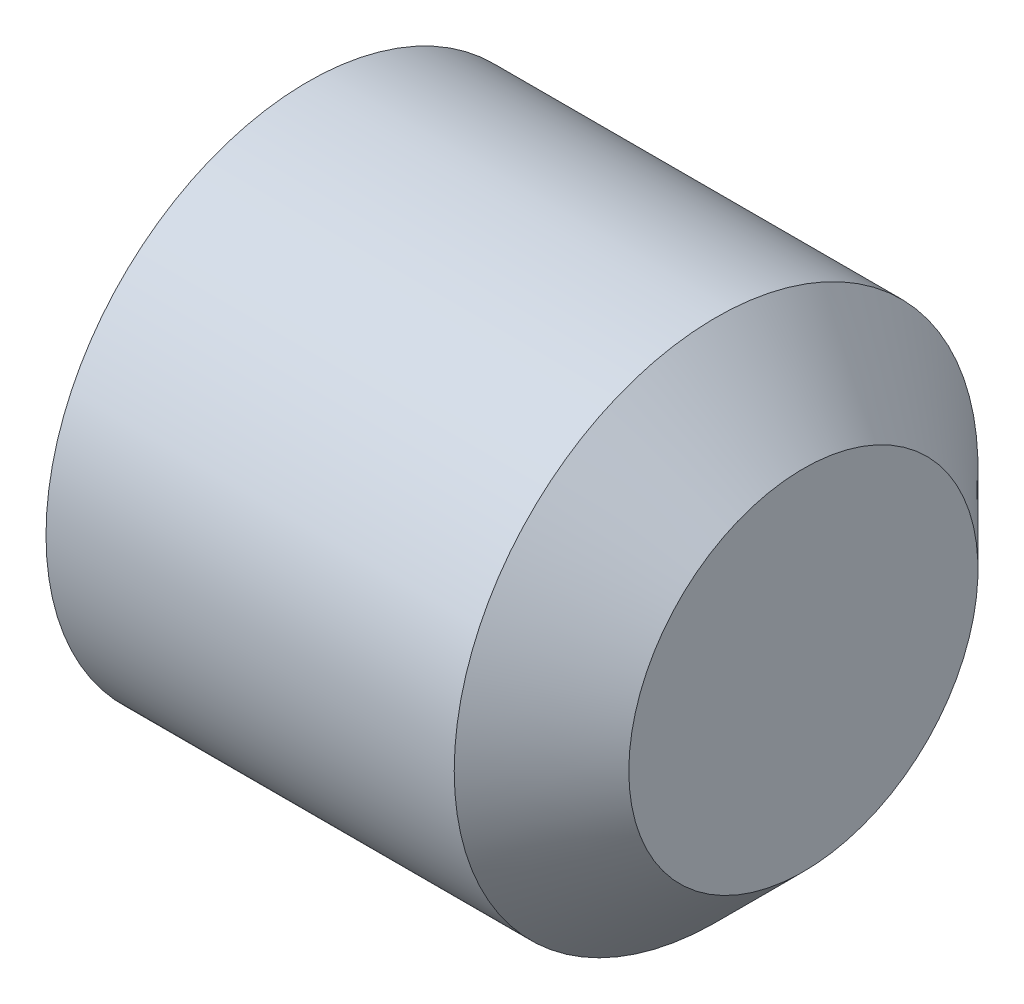
ISO-10303-21;
HEADER;
FILE_DESCRIPTION(('STEP AP214'),'2;1');
FILE_NAME('part.step','',(''),(''),'','','');
FILE_SCHEMA(('AUTOMOTIVE_DESIGN { 1 0 10303 214 1 1 1 1 }'));
ENDSEC;
DATA;
#1=APPLICATION_CONTEXT('core data for automotive mechanical design processes');
#2=APPLICATION_PROTOCOL_DEFINITION('international standard','automotive_design',2000,#1);
#3=PRODUCT_CONTEXT('',#1,'mechanical');
#4=PRODUCT('Part','Part','',(#3));
#5=PRODUCT_RELATED_PRODUCT_CATEGORY('part','',(#4));
#6=PRODUCT_DEFINITION_FORMATION('','',#4);
#7=PRODUCT_DEFINITION_CONTEXT('part definition',#1,'design');
#8=PRODUCT_DEFINITION('design','',#6,#7);
#9=PRODUCT_DEFINITION_SHAPE('','',#8);
#10=(LENGTH_UNIT() NAMED_UNIT(*) SI_UNIT(.MILLI.,.METRE.));
#11=(NAMED_UNIT(*) PLANE_ANGLE_UNIT() SI_UNIT($,.RADIAN.));
#12=(NAMED_UNIT(*) SI_UNIT($,.STERADIAN.) SOLID_ANGLE_UNIT());
#13=UNCERTAINTY_MEASURE_WITH_UNIT(LENGTH_MEASURE(1.E-05),#10,'distance_accuracy_value','');
#14=(GEOMETRIC_REPRESENTATION_CONTEXT(3) GLOBAL_UNCERTAINTY_ASSIGNED_CONTEXT((#13)) GLOBAL_UNIT_ASSIGNED_CONTEXT((#10,
#11,#12)) REPRESENTATION_CONTEXT('',''));
#15=CARTESIAN_POINT('',(0.,0.,0.));
#16=DIRECTION('',(0.,0.,1.));
#17=DIRECTION('',(1.,0.,0.));
#18=AXIS2_PLACEMENT_3D('',#15,#16,#17);
#19=CARTESIAN_POINT('',(0.,0.,0.));
#20=DIRECTION('',(-1.,0.,0.));
#21=DIRECTION('',(0.,0.,1.));
#22=AXIS2_PLACEMENT_3D('',#19,#20,#21);
#23=PLANE('',#22);
#24=CARTESIAN_POINT('',(0.,0.,0.));
#25=DIRECTION('',(-1.,0.,0.));
#26=DIRECTION('',(0.,0.,1.));
#27=AXIS2_PLACEMENT_3D('',#24,#25,#26);
#28=CIRCLE('',#27,1.2195);
#29=CARTESIAN_POINT('',(0.,0.,1.2195));
#30=VERTEX_POINT('',#29);
#31=EDGE_CURVE('E11',#30,#30,#28,.T.);
#32=ORIENTED_EDGE('',*,*,#31,.T.);
#33=EDGE_LOOP('',(#32));
#34=FACE_BOUND('',#33,.T.);
#35=DIRECTION('',(0.,0.,-1.));
#36=VECTOR('',#35,1.);
#37=CARTESIAN_POINT('',(0.,0.750000000000003,0.433012701892217));
#38=LINE('',#37,#36);
#39=CARTESIAN_POINT('',(0.,0.750000000000003,0.433012701892217));
#40=VERTEX_POINT('',#39);
#41=CARTESIAN_POINT('',(0.,0.750000000000003,-0.433012701892222));
#42=VERTEX_POINT('',#41);
#43=EDGE_CURVE('E126',#40,#42,#38,.T.);
#44=ORIENTED_EDGE('',*,*,#43,.F.);
#45=DIRECTION('',(0.,-0.866025403784438,0.5));
#46=VECTOR('',#45,1.);
#47=CARTESIAN_POINT('',(0.,0.750000000000003,0.433012701892217));
#48=LINE('',#47,#46);
#49=CARTESIAN_POINT('',(0.,0.,0.866025403784437));
#50=VERTEX_POINT('',#49);
#51=EDGE_CURVE('E48',#40,#50,#48,.T.);
#52=ORIENTED_EDGE('',*,*,#51,.T.);
#53=DIRECTION('',(0.,0.866025403784439,0.5));
#54=VECTOR('',#53,1.);
#55=CARTESIAN_POINT('',(0.,-0.749999999999996,0.433012701892218));
#56=LINE('',#55,#54);
#57=CARTESIAN_POINT('',(0.,-0.749999999999996,0.433012701892218));
#58=VERTEX_POINT('',#57);
#59=EDGE_CURVE('E117',#58,#50,#56,.T.);
#60=ORIENTED_EDGE('',*,*,#59,.F.);
#61=DIRECTION('',(0.,0.,-1.));
#62=VECTOR('',#61,1.);
#63=CARTESIAN_POINT('',(0.,-0.749999999999996,0.433012701892218));
#64=LINE('',#63,#62);
#65=CARTESIAN_POINT('',(0.,-0.749999999999996,-0.433012701892221));
#66=VERTEX_POINT('',#65);
#67=EDGE_CURVE('E120',#58,#66,#64,.T.);
#68=ORIENTED_EDGE('',*,*,#67,.T.);
#69=DIRECTION('',(0.,0.866025403784438,-0.500000000000001));
#70=VECTOR('',#69,1.);
#71=CARTESIAN_POINT('',(0.,-0.749999999999996,-0.433012701892221));
#72=LINE('',#71,#70);
#73=CARTESIAN_POINT('',(0.,0.,-0.866025403784441));
#74=VERTEX_POINT('',#73);
#75=EDGE_CURVE('E123',#66,#74,#72,.T.);
#76=ORIENTED_EDGE('',*,*,#75,.T.);
#77=DIRECTION('',(0.,-0.866025403784439,-0.5));
#78=VECTOR('',#77,1.);
#79=CARTESIAN_POINT('',(0.,0.750000000000003,-0.433012701892222));
#80=LINE('',#79,#78);
#81=EDGE_CURVE('E106',#42,#74,#80,.T.);
#82=ORIENTED_EDGE('',*,*,#81,.F.);
#83=EDGE_LOOP('',(#44,#52,#60,#68,#76,#82));
#84=FACE_BOUND('',#83,.T.);
#85=ADVANCED_FACE('F34',(#34,#84),#23,.T.);
#86=CARTESIAN_POINT('',(0.,0.,0.));
#87=DIRECTION('',(1.,0.,0.));
#88=DIRECTION('',(0.,0.,-1.));
#89=AXIS2_PLACEMENT_3D('',#86,#87,#88);
#90=CONICAL_SURFACE('',#89,1.2195,1.0471975511966);
#91=CARTESIAN_POINT('',(0.161946750507689,0.,0.));
#92=DIRECTION('',(-1.,0.,0.));
#93=DIRECTION('',(0.,0.,1.));
#94=AXIS2_PLACEMENT_3D('',#91,#92,#93);
#95=CIRCLE('',#94,1.5);
#96=CARTESIAN_POINT('',(0.161946750507689,0.,1.5));
#97=VERTEX_POINT('',#96);
#98=EDGE_CURVE('E41',#97,#97,#95,.T.);
#99=ORIENTED_EDGE('',*,*,#98,.T.);
#100=EDGE_LOOP('',(#99));
#101=FACE_BOUND('',#100,.T.);
#102=ORIENTED_EDGE('',*,*,#31,.F.);
#103=EDGE_LOOP('',(#102));
#104=FACE_BOUND('',#103,.T.);
#105=ADVANCED_FACE('F143',(#101,#104),#90,.T.);
#106=CARTESIAN_POINT('',(-12.7,0.,0.));
#107=DIRECTION('',(-1.,0.,0.));
#108=DIRECTION('',(0.,0.,1.));
#109=AXIS2_PLACEMENT_3D('',#106,#107,#108);
#110=CYLINDRICAL_SURFACE('',#109,1.5);
#111=CARTESIAN_POINT('',(2.50000000000004,0.,0.));
#112=DIRECTION('',(-1.,0.,0.));
#113=DIRECTION('',(0.,0.,1.));
#114=AXIS2_PLACEMENT_3D('',#111,#112,#113);
#115=CIRCLE('',#114,1.5);
#116=CARTESIAN_POINT('',(2.50000000000004,0.,1.5));
#117=VERTEX_POINT('',#116);
#118=EDGE_CURVE('E138',#117,#117,#115,.T.);
#119=ORIENTED_EDGE('',*,*,#118,.T.);
#120=EDGE_LOOP('',(#119));
#121=FACE_BOUND('',#120,.T.);
#122=ORIENTED_EDGE('',*,*,#98,.F.);
#123=EDGE_LOOP('',(#122));
#124=FACE_BOUND('',#123,.T.);
#125=ADVANCED_FACE('F146',(#121,#124),#110,.T.);
#126=CARTESIAN_POINT('',(2.50000000000004,0.,0.));
#127=DIRECTION('',(-1.,0.,0.));
#128=DIRECTION('',(0.,0.,1.));
#129=AXIS2_PLACEMENT_3D('',#126,#127,#128);
#130=CONICAL_SURFACE('',#129,1.5,0.785398163397488);
#131=CARTESIAN_POINT('',(3.,0.,0.));
#132=DIRECTION('',(-1.,0.,0.));
#133=DIRECTION('',(0.,0.,1.));
#134=AXIS2_PLACEMENT_3D('',#131,#132,#133);
#135=CIRCLE('',#134,1.);
#136=CARTESIAN_POINT('',(3.,0.,1.));
#137=VERTEX_POINT('',#136);
#138=EDGE_CURVE('E135',#137,#137,#135,.T.);
#139=ORIENTED_EDGE('',*,*,#138,.T.);
#140=EDGE_LOOP('',(#139));
#141=FACE_BOUND('',#140,.T.);
#142=ORIENTED_EDGE('',*,*,#118,.F.);
#143=EDGE_LOOP('',(#142));
#144=FACE_BOUND('',#143,.T.);
#145=ADVANCED_FACE('F148',(#141,#144),#130,.T.);
#146=CARTESIAN_POINT('',(3.,1.,0.));
#147=DIRECTION('',(1.,0.,0.));
#148=DIRECTION('',(0.,0.,-1.));
#149=AXIS2_PLACEMENT_3D('',#146,#147,#148);
#150=PLANE('',#149);
#151=ORIENTED_EDGE('',*,*,#138,.F.);
#152=EDGE_LOOP('',(#151));
#153=FACE_BOUND('',#152,.T.);
#154=ADVANCED_FACE('F155',(#153),#150,.T.);
#155=CARTESIAN_POINT('',(1.2,0.750000000000003,0.433012701892217));
#156=DIRECTION('',(0.,-0.5,-0.866025403784438));
#157=DIRECTION('',(0.,0.866025403784438,-0.5));
#158=AXIS2_PLACEMENT_3D('',#155,#156,#157);
#159=PLANE('',#158);
#160=ORIENTED_EDGE('',*,*,#51,.F.);
#161=DIRECTION('',(-1.,0.,0.));
#162=VECTOR('',#161,1.);
#163=CARTESIAN_POINT('',(1.2,0.750000000000003,0.433012701892217));
#164=LINE('',#163,#162);
#165=CARTESIAN_POINT('',(1.2,0.750000000000003,0.433012701892217));
#166=VERTEX_POINT('',#165);
#167=EDGE_CURVE('E53',#166,#40,#164,.T.);
#168=ORIENTED_EDGE('',*,*,#167,.F.);
#169=DIRECTION('',(0.,-0.866025403784438,0.5));
#170=VECTOR('',#169,1.);
#171=CARTESIAN_POINT('',(1.2,0.750000000000003,0.433012701892217));
#172=LINE('',#171,#170);
#173=CARTESIAN_POINT('',(1.2,0.,0.866025403784437));
#174=VERTEX_POINT('',#173);
#175=EDGE_CURVE('E80',#166,#174,#172,.T.);
#176=ORIENTED_EDGE('',*,*,#175,.T.);
#177=DIRECTION('',(-1.,0.,0.));
#178=VECTOR('',#177,1.);
#179=CARTESIAN_POINT('',(1.2,0.,0.866025403784437));
#180=LINE('',#179,#178);
#181=EDGE_CURVE('E133',#174,#50,#180,.T.);
#182=ORIENTED_EDGE('',*,*,#181,.T.);
#183=EDGE_LOOP('',(#160,#168,#176,#182));
#184=FACE_BOUND('',#183,.T.);
#185=ADVANCED_FACE('F186',(#184),#159,.T.);
#186=CARTESIAN_POINT('',(1.2,-0.749999999999996,0.433012701892218));
#187=DIRECTION('',(0.,-0.5,0.866025403784439));
#188=DIRECTION('',(0.,-0.866025403784439,-0.5));
#189=AXIS2_PLACEMENT_3D('',#186,#187,#188);
#190=PLANE('',#189);
#191=ORIENTED_EDGE('',*,*,#59,.T.);
#192=ORIENTED_EDGE('',*,*,#181,.F.);
#193=DIRECTION('',(0.,0.866025403784439,0.5));
#194=VECTOR('',#193,1.);
#195=CARTESIAN_POINT('',(1.2,-0.749999999999996,0.433012701892218));
#196=LINE('',#195,#194);
#197=CARTESIAN_POINT('',(1.2,-0.749999999999996,0.433012701892218));
#198=VERTEX_POINT('',#197);
#199=EDGE_CURVE('E266',#198,#174,#196,.T.);
#200=ORIENTED_EDGE('',*,*,#199,.F.);
#201=DIRECTION('',(-1.,0.,0.));
#202=VECTOR('',#201,1.);
#203=CARTESIAN_POINT('',(1.2,-0.749999999999996,0.433012701892218));
#204=LINE('',#203,#202);
#205=EDGE_CURVE('E131',#198,#58,#204,.T.);
#206=ORIENTED_EDGE('',*,*,#205,.T.);
#207=EDGE_LOOP('',(#191,#192,#200,#206));
#208=FACE_BOUND('',#207,.T.);
#209=ADVANCED_FACE('F182',(#208),#190,.F.);
#210=CARTESIAN_POINT('',(1.2,-0.749999999999996,0.433012701892218));
#211=DIRECTION('',(0.,1.,0.));
#212=DIRECTION('',(0.,0.,1.));
#213=AXIS2_PLACEMENT_3D('',#210,#211,#212);
#214=PLANE('',#213);
#215=ORIENTED_EDGE('',*,*,#67,.F.);
#216=ORIENTED_EDGE('',*,*,#205,.F.);
#217=DIRECTION('',(0.,0.,-1.));
#218=VECTOR('',#217,1.);
#219=CARTESIAN_POINT('',(1.2,-0.749999999999996,0.433012701892218));
#220=LINE('',#219,#218);
#221=CARTESIAN_POINT('',(1.2,-0.749999999999996,-0.433012701892221));
#222=VERTEX_POINT('',#221);
#223=EDGE_CURVE('E101',#198,#222,#220,.T.);
#224=ORIENTED_EDGE('',*,*,#223,.T.);
#225=DIRECTION('',(-1.,0.,0.));
#226=VECTOR('',#225,1.);
#227=CARTESIAN_POINT('',(1.2,-0.749999999999996,-0.433012701892221));
#228=LINE('',#227,#226);
#229=EDGE_CURVE('E96',#222,#66,#228,.T.);
#230=ORIENTED_EDGE('',*,*,#229,.T.);
#231=EDGE_LOOP('',(#215,#216,#224,#230));
#232=FACE_BOUND('',#231,.T.);
#233=ADVANCED_FACE('F179',(#232),#214,.T.);
#234=CARTESIAN_POINT('',(1.2,-0.749999999999996,-0.433012701892221));
#235=DIRECTION('',(0.,0.5,0.866025403784438));
#236=DIRECTION('',(0.,-0.866025403784438,0.500000000000001));
#237=AXIS2_PLACEMENT_3D('',#234,#235,#236);
#238=PLANE('',#237);
#239=ORIENTED_EDGE('',*,*,#75,.F.);
#240=ORIENTED_EDGE('',*,*,#229,.F.);
#241=DIRECTION('',(0.,0.866025403784438,-0.500000000000001));
#242=VECTOR('',#241,1.);
#243=CARTESIAN_POINT('',(1.2,-0.749999999999996,-0.433012701892221));
#244=LINE('',#243,#242);
#245=CARTESIAN_POINT('',(1.2,0.,-0.866025403784441));
#246=VERTEX_POINT('',#245);
#247=EDGE_CURVE('E91',#222,#246,#244,.T.);
#248=ORIENTED_EDGE('',*,*,#247,.T.);
#249=DIRECTION('',(-1.,0.,0.));
#250=VECTOR('',#249,1.);
#251=CARTESIAN_POINT('',(1.2,0.,-0.866025403784441));
#252=LINE('',#251,#250);
#253=EDGE_CURVE('E95',#246,#74,#252,.T.);
#254=ORIENTED_EDGE('',*,*,#253,.T.);
#255=EDGE_LOOP('',(#239,#240,#248,#254));
#256=FACE_BOUND('',#255,.T.);
#257=ADVANCED_FACE('F94',(#256),#238,.T.);
#258=CARTESIAN_POINT('',(1.2,0.750000000000003,-0.433012701892222));
#259=DIRECTION('',(0.,0.5,-0.866025403784439));
#260=DIRECTION('',(0.,0.866025403784439,0.5));
#261=AXIS2_PLACEMENT_3D('',#258,#259,#260);
#262=PLANE('',#261);
#263=ORIENTED_EDGE('',*,*,#81,.T.);
#264=ORIENTED_EDGE('',*,*,#253,.F.);
#265=DIRECTION('',(0.,-0.866025403784439,-0.5));
#266=VECTOR('',#265,1.);
#267=CARTESIAN_POINT('',(1.2,0.750000000000003,-0.433012701892222));
#268=LINE('',#267,#266);
#269=CARTESIAN_POINT('',(1.2,0.750000000000003,-0.433012701892222));
#270=VERTEX_POINT('',#269);
#271=EDGE_CURVE('E100',#270,#246,#268,.T.);
#272=ORIENTED_EDGE('',*,*,#271,.F.);
#273=DIRECTION('',(-1.,0.,0.));
#274=VECTOR('',#273,1.);
#275=CARTESIAN_POINT('',(1.2,0.750000000000003,-0.433012701892222));
#276=LINE('',#275,#274);
#277=EDGE_CURVE('E76',#270,#42,#276,.T.);
#278=ORIENTED_EDGE('',*,*,#277,.T.);
#279=EDGE_LOOP('',(#263,#264,#272,#278));
#280=FACE_BOUND('',#279,.T.);
#281=ADVANCED_FACE('F103',(#280),#262,.F.);
#282=CARTESIAN_POINT('',(1.2,0.750000000000003,0.433012701892217));
#283=DIRECTION('',(0.,1.,0.));
#284=DIRECTION('',(0.,0.,1.));
#285=AXIS2_PLACEMENT_3D('',#282,#283,#284);
#286=PLANE('',#285);
#287=ORIENTED_EDGE('',*,*,#43,.T.);
#288=ORIENTED_EDGE('',*,*,#277,.F.);
#289=DIRECTION('',(0.,0.,-1.));
#290=VECTOR('',#289,1.);
#291=CARTESIAN_POINT('',(1.2,0.750000000000003,0.433012701892217));
#292=LINE('',#291,#290);
#293=EDGE_CURVE('E111',#166,#270,#292,.T.);
#294=ORIENTED_EDGE('',*,*,#293,.F.);
#295=ORIENTED_EDGE('',*,*,#167,.T.);
#296=EDGE_LOOP('',(#287,#288,#294,#295));
#297=FACE_BOUND('',#296,.T.);
#298=ADVANCED_FACE('F167',(#297),#286,.F.);
#299=CARTESIAN_POINT('',(1.2,0.,0.866025403784436));
#300=DIRECTION('',(-1.,0.,0.));
#301=DIRECTION('',(0.,0.,1.));
#302=AXIS2_PLACEMENT_3D('',#299,#300,#301);
#303=PLANE('',#302);
#304=ORIENTED_EDGE('',*,*,#175,.F.);
#305=ORIENTED_EDGE('',*,*,#293,.T.);
#306=ORIENTED_EDGE('',*,*,#271,.T.);
#307=ORIENTED_EDGE('',*,*,#247,.F.);
#308=ORIENTED_EDGE('',*,*,#223,.F.);
#309=ORIENTED_EDGE('',*,*,#199,.T.);
#310=EDGE_LOOP('',(#304,#305,#306,#307,#308,#309));
#311=FACE_BOUND('',#310,.T.);
#312=ADVANCED_FACE('F109',(#311),#303,.T.);
#313=CLOSED_SHELL('',(#85,#105,#125,#145,#154,#185,#209,#233,#257,#281,#298,#312));
#314=MANIFOLD_SOLID_BREP('B2',#313);
#315=ADVANCED_BREP_SHAPE_REPRESENTATION('',(#18,#314),#14);
#316=SHAPE_DEFINITION_REPRESENTATION(#9,#315);
ENDSEC;
END-ISO-10303-21;
